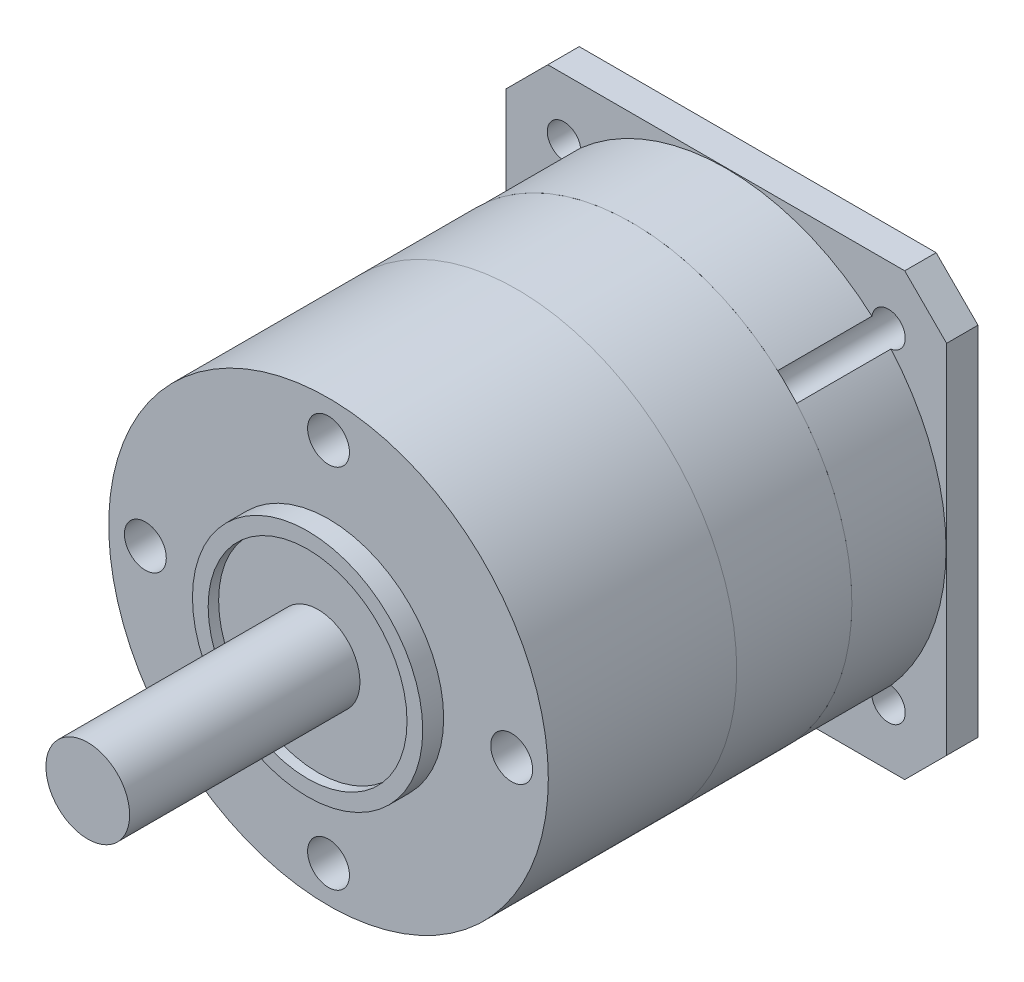
ISO-10303-21;
HEADER;
FILE_DESCRIPTION(('STEP AP214'),'2;1');
FILE_NAME('part.step','',(''),(''),'','','');
FILE_SCHEMA(('AUTOMOTIVE_DESIGN { 1 0 10303 214 1 1 1 1 }'));
ENDSEC;
DATA;
#1=APPLICATION_CONTEXT('core data for automotive mechanical design processes');
#2=APPLICATION_PROTOCOL_DEFINITION('international standard','automotive_design',2000,#1);
#3=PRODUCT_CONTEXT('',#1,'mechanical');
#4=PRODUCT('Part','Part','',(#3));
#5=PRODUCT_RELATED_PRODUCT_CATEGORY('part','',(#4));
#6=PRODUCT_DEFINITION_FORMATION('','',#4);
#7=PRODUCT_DEFINITION_CONTEXT('part definition',#1,'design');
#8=PRODUCT_DEFINITION('design','',#6,#7);
#9=PRODUCT_DEFINITION_SHAPE('','',#8);
#10=(LENGTH_UNIT() NAMED_UNIT(*) SI_UNIT(.MILLI.,.METRE.));
#11=(NAMED_UNIT(*) PLANE_ANGLE_UNIT() SI_UNIT($,.RADIAN.));
#12=(NAMED_UNIT(*) SI_UNIT($,.STERADIAN.) SOLID_ANGLE_UNIT());
#13=UNCERTAINTY_MEASURE_WITH_UNIT(LENGTH_MEASURE(1.E-05),#10,'distance_accuracy_value','');
#14=(GEOMETRIC_REPRESENTATION_CONTEXT(3) GLOBAL_UNCERTAINTY_ASSIGNED_CONTEXT((#13)) GLOBAL_UNIT_ASSIGNED_CONTEXT((#10,
#11,#12)) REPRESENTATION_CONTEXT('',''));
#15=CARTESIAN_POINT('',(0.,0.,0.));
#16=DIRECTION('',(0.,0.,1.));
#17=DIRECTION('',(1.,0.,0.));
#18=AXIS2_PLACEMENT_3D('',#15,#16,#17);
#19=CARTESIAN_POINT('',(0.,0.,64.));
#20=DIRECTION('',(0.,0.,-1.));
#21=DIRECTION('',(-1.,0.,0.));
#22=AXIS2_PLACEMENT_3D('',#19,#20,#21);
#23=CYLINDRICAL_SURFACE('',#22,4.);
#24=CARTESIAN_POINT('',(0.,0.,64.));
#25=DIRECTION('',(0.,0.,1.));
#26=DIRECTION('',(1.,0.,0.));
#27=AXIS2_PLACEMENT_3D('',#24,#25,#26);
#28=CIRCLE('',#27,4.);
#29=CARTESIAN_POINT('',(4.,0.,64.));
#30=VERTEX_POINT('',#29);
#31=EDGE_CURVE('E11',#30,#30,#28,.T.);
#32=ORIENTED_EDGE('',*,*,#31,.F.);
#33=EDGE_LOOP('',(#32));
#34=FACE_BOUND('',#33,.T.);
#35=CARTESIAN_POINT('',(0.,0.,41.));
#36=DIRECTION('',(0.,0.,1.));
#37=DIRECTION('',(1.,0.,0.));
#38=AXIS2_PLACEMENT_3D('',#35,#36,#37);
#39=CIRCLE('',#38,4.);
#40=CARTESIAN_POINT('',(4.,0.,41.));
#41=VERTEX_POINT('',#40);
#42=EDGE_CURVE('E51',#41,#41,#39,.T.);
#43=ORIENTED_EDGE('',*,*,#42,.T.);
#44=EDGE_LOOP('',(#43));
#45=FACE_BOUND('',#44,.T.);
#46=ADVANCED_FACE('F48',(#34,#45),#23,.T.);
#47=CARTESIAN_POINT('',(0.,0.,64.));
#48=DIRECTION('',(0.,0.,1.));
#49=DIRECTION('',(1.,0.,0.));
#50=AXIS2_PLACEMENT_3D('',#47,#48,#49);
#51=PLANE('',#50);
#52=ORIENTED_EDGE('',*,*,#31,.T.);
#53=EDGE_LOOP('',(#52));
#54=FACE_BOUND('',#53,.T.);
#55=ADVANCED_FACE('F63',(#54),#51,.T.);
#56=CARTESIAN_POINT('',(0.,0.,41.));
#57=DIRECTION('',(0.,0.,1.));
#58=DIRECTION('',(1.,0.,0.));
#59=AXIS2_PLACEMENT_3D('',#56,#57,#58);
#60=PLANE('',#59);
#61=ORIENTED_EDGE('',*,*,#42,.F.);
#62=EDGE_LOOP('',(#61));
#63=FACE_BOUND('',#62,.T.);
#64=ADVANCED_FACE('F61',(#63),#60,.F.);
#65=CLOSED_SHELL('',(#46,#55,#64));
#66=MANIFOLD_SOLID_BREP('B2',#65);
#67=CARTESIAN_POINT('',(0.,0.,141.39696961967));
#68=DIRECTION('',(0.,0.,-1.));
#69=DIRECTION('',(-1.,0.,0.));
#70=AXIS2_PLACEMENT_3D('',#67,#68,#69);
#71=CYLINDRICAL_SURFACE('',#70,21.);
#72=CARTESIAN_POINT('',(0.,0.,23.));
#73=DIRECTION('',(0.,0.,1.));
#74=DIRECTION('',(1.,0.,0.));
#75=AXIS2_PLACEMENT_3D('',#72,#73,#74);
#76=CIRCLE('',#75,21.);
#77=CARTESIAN_POINT('',(21.,0.,23.));
#78=VERTEX_POINT('',#77);
#79=EDGE_CURVE('E109',#78,#78,#76,.T.);
#80=ORIENTED_EDGE('',*,*,#79,.T.);
#81=EDGE_LOOP('',(#80));
#82=FACE_BOUND('',#81,.T.);
#83=CARTESIAN_POINT('',(0.,0.,41.));
#84=DIRECTION('',(0.,0.,1.));
#85=DIRECTION('',(1.,0.,0.));
#86=AXIS2_PLACEMENT_3D('',#83,#84,#85);
#87=CIRCLE('',#86,21.);
#88=CARTESIAN_POINT('',(21.,0.,41.));
#89=VERTEX_POINT('',#88);
#90=EDGE_CURVE('E101',#89,#89,#87,.T.);
#91=ORIENTED_EDGE('',*,*,#90,.F.);
#92=EDGE_LOOP('',(#91));
#93=FACE_BOUND('',#92,.T.);
#94=ADVANCED_FACE('F97',(#82,#93),#71,.T.);
#95=CARTESIAN_POINT('',(0.,0.,23.));
#96=DIRECTION('',(0.,0.,1.));
#97=DIRECTION('',(1.,0.,0.));
#98=AXIS2_PLACEMENT_3D('',#95,#96,#97);
#99=PLANE('',#98);
#100=ORIENTED_EDGE('',*,*,#79,.F.);
#101=EDGE_LOOP('',(#100));
#102=FACE_BOUND('',#101,.T.);
#103=ADVANCED_FACE('F164',(#102),#99,.F.);
#104=CARTESIAN_POINT('',(0.,0.,41.));
#105=DIRECTION('',(0.,0.,1.));
#106=DIRECTION('',(1.,0.,0.));
#107=AXIS2_PLACEMENT_3D('',#104,#105,#106);
#108=PLANE('',#107);
#109=CARTESIAN_POINT('',(0.,17.5,41.));
#110=DIRECTION('',(0.,0.,1.));
#111=DIRECTION('',(1.,0.,0.));
#112=AXIS2_PLACEMENT_3D('',#109,#110,#111);
#113=CIRCLE('',#112,2.);
#114=CARTESIAN_POINT('',(2.,17.5,41.));
#115=VERTEX_POINT('',#114);
#116=EDGE_CURVE('E146',#115,#115,#113,.T.);
#117=ORIENTED_EDGE('',*,*,#116,.F.);
#118=EDGE_LOOP('',(#117));
#119=FACE_BOUND('',#118,.T.);
#120=CARTESIAN_POINT('',(17.5000000000005,4.94165217184309E-13,41.));
#121=DIRECTION('',(0.,0.,1.));
#122=DIRECTION('',(1.,0.,0.));
#123=AXIS2_PLACEMENT_3D('',#120,#121,#122);
#124=CIRCLE('',#123,2.);
#125=CARTESIAN_POINT('',(19.5000000000005,4.94165217184309E-13,41.));
#126=VERTEX_POINT('',#125);
#127=EDGE_CURVE('E140',#126,#126,#124,.T.);
#128=ORIENTED_EDGE('',*,*,#127,.F.);
#129=EDGE_LOOP('',(#128));
#130=FACE_BOUND('',#129,.T.);
#131=CARTESIAN_POINT('',(9.88330434368617E-13,-17.5,41.));
#132=DIRECTION('',(0.,0.,1.));
#133=DIRECTION('',(1.,0.,0.));
#134=AXIS2_PLACEMENT_3D('',#131,#132,#133);
#135=CIRCLE('',#134,2.);
#136=CARTESIAN_POINT('',(2.00000000000099,-17.5,41.));
#137=VERTEX_POINT('',#136);
#138=EDGE_CURVE('E134',#137,#137,#135,.T.);
#139=ORIENTED_EDGE('',*,*,#138,.F.);
#140=EDGE_LOOP('',(#139));
#141=FACE_BOUND('',#140,.T.);
#142=CARTESIAN_POINT('',(-17.4999999999995,-4.96308349082816E-13,41.));
#143=DIRECTION('',(0.,0.,1.));
#144=DIRECTION('',(1.,0.,0.));
#145=AXIS2_PLACEMENT_3D('',#142,#143,#144);
#146=CIRCLE('',#145,2.);
#147=CARTESIAN_POINT('',(-15.4999999999995,-4.96308349082816E-13,41.));
#148=VERTEX_POINT('',#147);
#149=EDGE_CURVE('E128',#148,#148,#146,.T.);
#150=ORIENTED_EDGE('',*,*,#149,.F.);
#151=EDGE_LOOP('',(#150));
#152=FACE_BOUND('',#151,.T.);
#153=CARTESIAN_POINT('',(0.,0.,41.));
#154=DIRECTION('',(0.,0.,1.));
#155=DIRECTION('',(1.,0.,0.));
#156=AXIS2_PLACEMENT_3D('',#153,#154,#155);
#157=CIRCLE('',#156,11.);
#158=CARTESIAN_POINT('',(11.,0.,41.));
#159=VERTEX_POINT('',#158);
#160=EDGE_CURVE('E47',#159,#159,#157,.T.);
#161=ORIENTED_EDGE('',*,*,#160,.F.);
#162=EDGE_LOOP('',(#161));
#163=FACE_BOUND('',#162,.T.);
#164=ORIENTED_EDGE('',*,*,#90,.T.);
#165=EDGE_LOOP('',(#164));
#166=FACE_BOUND('',#165,.T.);
#167=ADVANCED_FACE('F99',(#119,#130,#141,#152,#163,#166),#108,.T.);
#168=CARTESIAN_POINT('',(0.,0.,43.));
#169=DIRECTION('',(0.,0.,-1.));
#170=DIRECTION('',(-1.,0.,0.));
#171=AXIS2_PLACEMENT_3D('',#168,#169,#170);
#172=CYLINDRICAL_SURFACE('',#171,11.);
#173=CARTESIAN_POINT('',(0.,0.,43.));
#174=DIRECTION('',(0.,0.,1.));
#175=DIRECTION('',(1.,0.,0.));
#176=AXIS2_PLACEMENT_3D('',#173,#174,#175);
#177=CIRCLE('',#176,11.);
#178=CARTESIAN_POINT('',(11.,0.,43.));
#179=VERTEX_POINT('',#178);
#180=EDGE_CURVE('E111',#179,#179,#177,.T.);
#181=ORIENTED_EDGE('',*,*,#180,.F.);
#182=EDGE_LOOP('',(#181));
#183=FACE_BOUND('',#182,.T.);
#184=ORIENTED_EDGE('',*,*,#160,.T.);
#185=EDGE_LOOP('',(#184));
#186=FACE_BOUND('',#185,.T.);
#187=ADVANCED_FACE('F163',(#183,#186),#172,.T.);
#188=CARTESIAN_POINT('',(0.,0.,43.));
#189=DIRECTION('',(0.,0.,1.));
#190=DIRECTION('',(1.,0.,0.));
#191=AXIS2_PLACEMENT_3D('',#188,#189,#190);
#192=PLANE('',#191);
#193=CARTESIAN_POINT('',(0.,0.,43.));
#194=DIRECTION('',(0.,0.,1.));
#195=DIRECTION('',(1.,0.,0.));
#196=AXIS2_PLACEMENT_3D('',#193,#194,#195);
#197=CIRCLE('',#196,9.5);
#198=CARTESIAN_POINT('',(9.5,0.,43.));
#199=VERTEX_POINT('',#198);
#200=EDGE_CURVE('E121',#199,#199,#197,.T.);
#201=ORIENTED_EDGE('',*,*,#200,.F.);
#202=EDGE_LOOP('',(#201));
#203=FACE_BOUND('',#202,.T.);
#204=ORIENTED_EDGE('',*,*,#180,.T.);
#205=EDGE_LOOP('',(#204));
#206=FACE_BOUND('',#205,.T.);
#207=ADVANCED_FACE('F183',(#203,#206),#192,.T.);
#208=CARTESIAN_POINT('',(0.,0.,42.));
#209=DIRECTION('',(0.,0.,1.));
#210=DIRECTION('',(1.,0.,0.));
#211=AXIS2_PLACEMENT_3D('',#208,#209,#210);
#212=CYLINDRICAL_SURFACE('',#211,9.5);
#213=CARTESIAN_POINT('',(0.,0.,42.));
#214=DIRECTION('',(0.,0.,1.));
#215=DIRECTION('',(1.,0.,0.));
#216=AXIS2_PLACEMENT_3D('',#213,#214,#215);
#217=CIRCLE('',#216,9.5);
#218=CARTESIAN_POINT('',(9.5,0.,42.));
#219=VERTEX_POINT('',#218);
#220=EDGE_CURVE('E117',#219,#219,#217,.T.);
#221=ORIENTED_EDGE('',*,*,#220,.F.);
#222=EDGE_LOOP('',(#221));
#223=FACE_BOUND('',#222,.T.);
#224=ORIENTED_EDGE('',*,*,#200,.T.);
#225=EDGE_LOOP('',(#224));
#226=FACE_BOUND('',#225,.T.);
#227=ADVANCED_FACE('F187',(#223,#226),#212,.F.);
#228=CARTESIAN_POINT('',(0.,0.,42.));
#229=DIRECTION('',(0.,0.,1.));
#230=DIRECTION('',(1.,0.,0.));
#231=AXIS2_PLACEMENT_3D('',#228,#229,#230);
#232=PLANE('',#231);
#233=ORIENTED_EDGE('',*,*,#220,.T.);
#234=EDGE_LOOP('',(#233));
#235=FACE_BOUND('',#234,.T.);
#236=ADVANCED_FACE('F191',(#235),#232,.T.);
#237=CARTESIAN_POINT('',(-17.4999999999995,-4.96308349082816E-13,31.));
#238=DIRECTION('',(0.,0.,1.));
#239=DIRECTION('',(1.,0.,0.));
#240=AXIS2_PLACEMENT_3D('',#237,#238,#239);
#241=CYLINDRICAL_SURFACE('',#240,2.);
#242=CARTESIAN_POINT('',(-17.4999999999995,-4.96308349082816E-13,31.));
#243=DIRECTION('',(0.,0.,1.));
#244=DIRECTION('',(1.,0.,0.));
#245=AXIS2_PLACEMENT_3D('',#242,#243,#244);
#246=CIRCLE('',#245,2.);
#247=CARTESIAN_POINT('',(-15.4999999999995,-4.96308349082816E-13,31.));
#248=VERTEX_POINT('',#247);
#249=EDGE_CURVE('E131',#248,#248,#246,.T.);
#250=ORIENTED_EDGE('',*,*,#249,.F.);
#251=EDGE_LOOP('',(#250));
#252=FACE_BOUND('',#251,.T.);
#253=ORIENTED_EDGE('',*,*,#149,.T.);
#254=EDGE_LOOP('',(#253));
#255=FACE_BOUND('',#254,.T.);
#256=ADVANCED_FACE('F195',(#252,#255),#241,.F.);
#257=CARTESIAN_POINT('',(-17.4999999999995,-4.96308349082816E-13,31.));
#258=DIRECTION('',(0.,0.,1.));
#259=DIRECTION('',(1.,0.,0.));
#260=AXIS2_PLACEMENT_3D('',#257,#258,#259);
#261=PLANE('',#260);
#262=ORIENTED_EDGE('',*,*,#249,.T.);
#263=EDGE_LOOP('',(#262));
#264=FACE_BOUND('',#263,.T.);
#265=ADVANCED_FACE('F198',(#264),#261,.T.);
#266=CARTESIAN_POINT('',(9.88330434368617E-13,-17.5,31.));
#267=DIRECTION('',(0.,0.,1.));
#268=DIRECTION('',(1.,0.,0.));
#269=AXIS2_PLACEMENT_3D('',#266,#267,#268);
#270=CYLINDRICAL_SURFACE('',#269,2.);
#271=CARTESIAN_POINT('',(9.88330434368617E-13,-17.5,31.));
#272=DIRECTION('',(0.,0.,1.));
#273=DIRECTION('',(1.,0.,0.));
#274=AXIS2_PLACEMENT_3D('',#271,#272,#273);
#275=CIRCLE('',#274,2.);
#276=CARTESIAN_POINT('',(2.00000000000099,-17.5,31.));
#277=VERTEX_POINT('',#276);
#278=EDGE_CURVE('E137',#277,#277,#275,.T.);
#279=ORIENTED_EDGE('',*,*,#278,.F.);
#280=EDGE_LOOP('',(#279));
#281=FACE_BOUND('',#280,.T.);
#282=ORIENTED_EDGE('',*,*,#138,.T.);
#283=EDGE_LOOP('',(#282));
#284=FACE_BOUND('',#283,.T.);
#285=ADVANCED_FACE('F202',(#281,#284),#270,.F.);
#286=CARTESIAN_POINT('',(9.88330434368617E-13,-17.5,31.));
#287=DIRECTION('',(0.,0.,1.));
#288=DIRECTION('',(1.,0.,0.));
#289=AXIS2_PLACEMENT_3D('',#286,#287,#288);
#290=PLANE('',#289);
#291=ORIENTED_EDGE('',*,*,#278,.T.);
#292=EDGE_LOOP('',(#291));
#293=FACE_BOUND('',#292,.T.);
#294=ADVANCED_FACE('F206',(#293),#290,.T.);
#295=CARTESIAN_POINT('',(17.5000000000005,4.94165217184309E-13,31.));
#296=DIRECTION('',(0.,0.,1.));
#297=DIRECTION('',(1.,0.,0.));
#298=AXIS2_PLACEMENT_3D('',#295,#296,#297);
#299=CYLINDRICAL_SURFACE('',#298,2.);
#300=CARTESIAN_POINT('',(17.5000000000005,4.94165217184309E-13,31.));
#301=DIRECTION('',(0.,0.,1.));
#302=DIRECTION('',(1.,0.,0.));
#303=AXIS2_PLACEMENT_3D('',#300,#301,#302);
#304=CIRCLE('',#303,2.);
#305=CARTESIAN_POINT('',(19.5000000000005,4.94165217184309E-13,31.));
#306=VERTEX_POINT('',#305);
#307=EDGE_CURVE('E143',#306,#306,#304,.T.);
#308=ORIENTED_EDGE('',*,*,#307,.F.);
#309=EDGE_LOOP('',(#308));
#310=FACE_BOUND('',#309,.T.);
#311=ORIENTED_EDGE('',*,*,#127,.T.);
#312=EDGE_LOOP('',(#311));
#313=FACE_BOUND('',#312,.T.);
#314=ADVANCED_FACE('F210',(#310,#313),#299,.F.);
#315=CARTESIAN_POINT('',(17.5000000000005,4.94165217184309E-13,31.));
#316=DIRECTION('',(0.,0.,1.));
#317=DIRECTION('',(1.,0.,0.));
#318=AXIS2_PLACEMENT_3D('',#315,#316,#317);
#319=PLANE('',#318);
#320=ORIENTED_EDGE('',*,*,#307,.T.);
#321=EDGE_LOOP('',(#320));
#322=FACE_BOUND('',#321,.T.);
#323=ADVANCED_FACE('F157',(#322),#319,.T.);
#324=CARTESIAN_POINT('',(0.,17.5,31.));
#325=DIRECTION('',(0.,0.,1.));
#326=DIRECTION('',(1.,0.,0.));
#327=AXIS2_PLACEMENT_3D('',#324,#325,#326);
#328=CYLINDRICAL_SURFACE('',#327,2.);
#329=CARTESIAN_POINT('',(0.,17.5,31.));
#330=DIRECTION('',(0.,0.,1.));
#331=DIRECTION('',(1.,0.,0.));
#332=AXIS2_PLACEMENT_3D('',#329,#330,#331);
#333=CIRCLE('',#332,2.);
#334=CARTESIAN_POINT('',(2.,17.5,31.));
#335=VERTEX_POINT('',#334);
#336=EDGE_CURVE('E126',#335,#335,#333,.T.);
#337=ORIENTED_EDGE('',*,*,#336,.F.);
#338=EDGE_LOOP('',(#337));
#339=FACE_BOUND('',#338,.T.);
#340=ORIENTED_EDGE('',*,*,#116,.T.);
#341=EDGE_LOOP('',(#340));
#342=FACE_BOUND('',#341,.T.);
#343=ADVANCED_FACE('F154',(#339,#342),#328,.F.);
#344=CARTESIAN_POINT('',(0.,17.5,31.));
#345=DIRECTION('',(0.,0.,1.));
#346=DIRECTION('',(1.,0.,0.));
#347=AXIS2_PLACEMENT_3D('',#344,#345,#346);
#348=PLANE('',#347);
#349=ORIENTED_EDGE('',*,*,#336,.T.);
#350=EDGE_LOOP('',(#349));
#351=FACE_BOUND('',#350,.T.);
#352=ADVANCED_FACE('F152',(#351),#348,.T.);
#353=CLOSED_SHELL('',(#94,#103,#167,#187,#207,#227,#236,#256,#265,#285,#294,#314,#323,#343,#352));
#354=MANIFOLD_SOLID_BREP('B6',#353);
#355=CARTESIAN_POINT('',(0.,0.,105.39696961967));
#356=DIRECTION('',(0.,0.,-1.));
#357=DIRECTION('',(-1.,0.,0.));
#358=AXIS2_PLACEMENT_3D('',#355,#356,#357);
#359=CYLINDRICAL_SURFACE('',#358,21.);
#360=CARTESIAN_POINT('',(0.,0.,12.));
#361=DIRECTION('',(0.,0.,1.));
#362=DIRECTION('',(1.,0.,0.));
#363=AXIS2_PLACEMENT_3D('',#360,#361,#362);
#364=CIRCLE('',#363,21.);
#365=CARTESIAN_POINT('',(21.,0.,12.));
#366=VERTEX_POINT('',#365);
#367=EDGE_CURVE('E335',#366,#366,#364,.T.);
#368=ORIENTED_EDGE('',*,*,#367,.T.);
#369=EDGE_LOOP('',(#368));
#370=FACE_BOUND('',#369,.T.);
#371=CARTESIAN_POINT('',(0.,0.,23.));
#372=DIRECTION('',(0.,0.,1.));
#373=DIRECTION('',(1.,0.,0.));
#374=AXIS2_PLACEMENT_3D('',#371,#372,#373);
#375=CIRCLE('',#374,21.);
#376=CARTESIAN_POINT('',(21.,0.,23.));
#377=VERTEX_POINT('',#376);
#378=EDGE_CURVE('E96',#377,#377,#375,.T.);
#379=ORIENTED_EDGE('',*,*,#378,.F.);
#380=EDGE_LOOP('',(#379));
#381=FACE_BOUND('',#380,.T.);
#382=ADVANCED_FACE('F328',(#370,#381),#359,.T.);
#383=CARTESIAN_POINT('',(0.,0.,12.));
#384=DIRECTION('',(0.,0.,1.));
#385=DIRECTION('',(1.,0.,0.));
#386=AXIS2_PLACEMENT_3D('',#383,#384,#385);
#387=PLANE('',#386);
#388=ORIENTED_EDGE('',*,*,#367,.F.);
#389=EDGE_LOOP('',(#388));
#390=FACE_BOUND('',#389,.T.);
#391=ADVANCED_FACE('F343',(#390),#387,.F.);
#392=CARTESIAN_POINT('',(0.,0.,23.));
#393=DIRECTION('',(0.,0.,1.));
#394=DIRECTION('',(1.,0.,0.));
#395=AXIS2_PLACEMENT_3D('',#392,#393,#394);
#396=PLANE('',#395);
#397=ORIENTED_EDGE('',*,*,#378,.T.);
#398=EDGE_LOOP('',(#397));
#399=FACE_BOUND('',#398,.T.);
#400=ADVANCED_FACE('F330',(#399),#396,.T.);
#401=CLOSED_SHELL('',(#382,#391,#400));
#402=MANIFOLD_SOLID_BREP('B42',#401);
#403=CARTESIAN_POINT('',(0.,0.,83.39696961967));
#404=DIRECTION('',(0.,0.,-1.));
#405=DIRECTION('',(-1.,0.,0.));
#406=AXIS2_PLACEMENT_3D('',#403,#404,#405);
#407=CYLINDRICAL_SURFACE('',#406,21.);
#408=CARTESIAN_POINT('',(0.,0.,3.));
#409=DIRECTION('',(0.,0.,1.));
#410=DIRECTION('',(1.,0.,0.));
#411=AXIS2_PLACEMENT_3D('',#408,#409,#410);
#412=CIRCLE('',#411,21.);
#413=CARTESIAN_POINT('',(-13.9161898270176,-15.727035979434,3.));
#414=VERTEX_POINT('',#413);
#415=CARTESIAN_POINT('',(13.9161898270176,-15.727035979434,3.));
#416=VERTEX_POINT('',#415);
#417=EDGE_CURVE('E534',#414,#416,#412,.T.);
#418=ORIENTED_EDGE('',*,*,#417,.T.);
#419=DIRECTION('',(0.,0.,-1.));
#420=VECTOR('',#419,1.);
#421=CARTESIAN_POINT('',(13.9161898270176,-15.727035979434,7.50000000000001));
#422=LINE('',#421,#420);
#423=CARTESIAN_POINT('',(13.9161898270177,-15.727035979434,12.));
#424=VERTEX_POINT('',#423);
#425=EDGE_CURVE('E573',#424,#416,#422,.T.);
#426=ORIENTED_EDGE('',*,*,#425,.F.);
#427=CARTESIAN_POINT('',(0.,0.,12.));
#428=DIRECTION('',(0.,0.,1.));
#429=DIRECTION('',(1.,0.,0.));
#430=AXIS2_PLACEMENT_3D('',#427,#428,#429);
#431=CIRCLE('',#430,21.);
#432=CARTESIAN_POINT('',(-13.9161898270176,-15.727035979434,12.));
#433=VERTEX_POINT('',#432);
#434=EDGE_CURVE('E518',#433,#424,#431,.T.);
#435=ORIENTED_EDGE('',*,*,#434,.F.);
#436=DIRECTION('',(0.,0.,-1.));
#437=VECTOR('',#436,1.);
#438=CARTESIAN_POINT('',(-13.9161898270176,-15.727035979434,7.50000000000001));
#439=LINE('',#438,#437);
#440=EDGE_CURVE('E560',#414,#433,#439,.F.);
#441=ORIENTED_EDGE('',*,*,#440,.F.);
#442=EDGE_LOOP('',(#418,#426,#435,#441));
#443=FACE_BOUND('',#442,.T.);
#444=ADVANCED_FACE('F370',(#443),#407,.T.);
#445=CARTESIAN_POINT('',(-15.727035979434,13.9161898270176,3.));
#446=VERTEX_POINT('',#445);
#447=CARTESIAN_POINT('',(-15.727035979434,-13.9161898270176,3.));
#448=VERTEX_POINT('',#447);
#449=EDGE_CURVE('E540',#446,#448,#412,.T.);
#450=ORIENTED_EDGE('',*,*,#449,.T.);
#451=DIRECTION('',(0.,0.,-1.));
#452=VECTOR('',#451,1.);
#453=CARTESIAN_POINT('',(-15.727035979434,-13.9161898270176,7.50000000000001));
#454=LINE('',#453,#452);
#455=CARTESIAN_POINT('',(-15.727035979434,-13.9161898270177,12.));
#456=VERTEX_POINT('',#455);
#457=EDGE_CURVE('E551',#456,#448,#454,.T.);
#458=ORIENTED_EDGE('',*,*,#457,.F.);
#459=CARTESIAN_POINT('',(-15.727035979434,13.9161898270176,12.));
#460=VERTEX_POINT('',#459);
#461=EDGE_CURVE('E512',#460,#456,#431,.T.);
#462=ORIENTED_EDGE('',*,*,#461,.F.);
#463=DIRECTION('',(0.,0.,-1.));
#464=VECTOR('',#463,1.);
#465=CARTESIAN_POINT('',(-15.727035979434,13.9161898270176,7.50000000000001));
#466=LINE('',#465,#464);
#467=EDGE_CURVE('E490',#446,#460,#466,.F.);
#468=ORIENTED_EDGE('',*,*,#467,.F.);
#469=EDGE_LOOP('',(#450,#458,#462,#468));
#470=FACE_BOUND('',#469,.T.);
#471=ADVANCED_FACE('F550',(#470),#407,.T.);
#472=CARTESIAN_POINT('',(13.9161898270176,15.727035979434,3.));
#473=VERTEX_POINT('',#472);
#474=CARTESIAN_POINT('',(-13.9161898270176,15.727035979434,3.));
#475=VERTEX_POINT('',#474);
#476=EDGE_CURVE('E504',#473,#475,#412,.T.);
#477=ORIENTED_EDGE('',*,*,#476,.T.);
#478=DIRECTION('',(0.,0.,-1.));
#479=VECTOR('',#478,1.);
#480=CARTESIAN_POINT('',(-13.9161898270176,15.727035979434,7.50000000000001));
#481=LINE('',#480,#479);
#482=CARTESIAN_POINT('',(-13.9161898270177,15.727035979434,12.));
#483=VERTEX_POINT('',#482);
#484=EDGE_CURVE('E487',#483,#475,#481,.T.);
#485=ORIENTED_EDGE('',*,*,#484,.F.);
#486=CARTESIAN_POINT('',(13.9161898270176,15.727035979434,12.));
#487=VERTEX_POINT('',#486);
#488=EDGE_CURVE('E502',#487,#483,#431,.T.);
#489=ORIENTED_EDGE('',*,*,#488,.F.);
#490=DIRECTION('',(0.,0.,-1.));
#491=VECTOR('',#490,1.);
#492=CARTESIAN_POINT('',(13.9161898270176,15.727035979434,7.50000000000001));
#493=LINE('',#492,#491);
#494=EDGE_CURVE('E525',#473,#487,#493,.F.);
#495=ORIENTED_EDGE('',*,*,#494,.F.);
#496=EDGE_LOOP('',(#477,#485,#489,#495));
#497=FACE_BOUND('',#496,.T.);
#498=ADVANCED_FACE('F500',(#497),#407,.T.);
#499=CARTESIAN_POINT('',(-21.05,-21.05,3.));
#500=DIRECTION('',(1.,0.,0.));
#501=DIRECTION('',(0.,0.,-1.));
#502=AXIS2_PLACEMENT_3D('',#499,#500,#501);
#503=PLANE('',#502);
#504=DIRECTION('',(0.,-1.,0.));
#505=VECTOR('',#504,1.);
#506=CARTESIAN_POINT('',(-21.05,-21.05,0.));
#507=LINE('',#506,#505);
#508=CARTESIAN_POINT('',(-21.05,17.05,0.));
#509=VERTEX_POINT('',#508);
#510=CARTESIAN_POINT('',(-21.05,-17.05,0.));
#511=VERTEX_POINT('',#510);
#512=EDGE_CURVE('E511',#509,#511,#507,.T.);
#513=ORIENTED_EDGE('',*,*,#512,.T.);
#514=DIRECTION('',(0.,0.,1.));
#515=VECTOR('',#514,1.);
#516=CARTESIAN_POINT('',(-21.05,-17.05,3.));
#517=LINE('',#516,#515);
#518=CARTESIAN_POINT('',(-21.05,-17.05,3.));
#519=VERTEX_POINT('',#518);
#520=EDGE_CURVE('E666',#511,#519,#517,.T.);
#521=ORIENTED_EDGE('',*,*,#520,.T.);
#522=DIRECTION('',(0.,-1.,0.));
#523=VECTOR('',#522,1.);
#524=CARTESIAN_POINT('',(-21.05,-21.05,3.));
#525=LINE('',#524,#523);
#526=CARTESIAN_POINT('',(-21.05,17.05,3.));
#527=VERTEX_POINT('',#526);
#528=EDGE_CURVE('E640',#527,#519,#525,.T.);
#529=ORIENTED_EDGE('',*,*,#528,.F.);
#530=DIRECTION('',(0.,0.,-1.));
#531=VECTOR('',#530,1.);
#532=CARTESIAN_POINT('',(-21.05,17.05,3.));
#533=LINE('',#532,#531);
#534=EDGE_CURVE('E663',#527,#509,#533,.T.);
#535=ORIENTED_EDGE('',*,*,#534,.T.);
#536=EDGE_LOOP('',(#513,#521,#529,#535));
#537=FACE_BOUND('',#536,.T.);
#538=ADVANCED_FACE('F671',(#537),#503,.F.);
#539=CARTESIAN_POINT('',(21.05,-21.05,3.));
#540=DIRECTION('',(0.,1.,0.));
#541=DIRECTION('',(-1.,0.,0.));
#542=AXIS2_PLACEMENT_3D('',#539,#540,#541);
#543=PLANE('',#542);
#544=DIRECTION('',(1.,0.,0.));
#545=VECTOR('',#544,1.);
#546=CARTESIAN_POINT('',(21.05,-21.05,0.));
#547=LINE('',#546,#545);
#548=CARTESIAN_POINT('',(-17.05,-21.05,0.));
#549=VERTEX_POINT('',#548);
#550=CARTESIAN_POINT('',(17.05,-21.05,0.));
#551=VERTEX_POINT('',#550);
#552=EDGE_CURVE('E516',#549,#551,#547,.T.);
#553=ORIENTED_EDGE('',*,*,#552,.T.);
#554=DIRECTION('',(0.,0.,1.));
#555=VECTOR('',#554,1.);
#556=CARTESIAN_POINT('',(17.05,-21.05,3.));
#557=LINE('',#556,#555);
#558=CARTESIAN_POINT('',(17.05,-21.05,3.));
#559=VERTEX_POINT('',#558);
#560=EDGE_CURVE('E654',#551,#559,#557,.T.);
#561=ORIENTED_EDGE('',*,*,#560,.T.);
#562=DIRECTION('',(1.,0.,0.));
#563=VECTOR('',#562,1.);
#564=CARTESIAN_POINT('',(21.05,-21.05,3.));
#565=LINE('',#564,#563);
#566=CARTESIAN_POINT('',(-17.05,-21.05,3.));
#567=VERTEX_POINT('',#566);
#568=EDGE_CURVE('E679',#567,#559,#565,.T.);
#569=ORIENTED_EDGE('',*,*,#568,.F.);
#570=DIRECTION('',(0.,0.,-1.));
#571=VECTOR('',#570,1.);
#572=CARTESIAN_POINT('',(-17.05,-21.05,3.));
#573=LINE('',#572,#571);
#574=EDGE_CURVE('E651',#567,#549,#573,.T.);
#575=ORIENTED_EDGE('',*,*,#574,.T.);
#576=EDGE_LOOP('',(#553,#561,#569,#575));
#577=FACE_BOUND('',#576,.T.);
#578=ADVANCED_FACE('F683',(#577),#543,.F.);
#579=CARTESIAN_POINT('',(21.05,-21.05,3.));
#580=DIRECTION('',(-1.,0.,0.));
#581=DIRECTION('',(0.,0.,1.));
#582=AXIS2_PLACEMENT_3D('',#579,#580,#581);
#583=PLANE('',#582);
#584=DIRECTION('',(0.,1.,0.));
#585=VECTOR('',#584,1.);
#586=CARTESIAN_POINT('',(21.05,-21.05,3.));
#587=LINE('',#586,#585);
#588=CARTESIAN_POINT('',(21.05,-17.05,3.));
#589=VERTEX_POINT('',#588);
#590=CARTESIAN_POINT('',(21.05,17.05,3.));
#591=VERTEX_POINT('',#590);
#592=EDGE_CURVE('E541',#589,#591,#587,.T.);
#593=ORIENTED_EDGE('',*,*,#592,.F.);
#594=DIRECTION('',(0.,0.,-1.));
#595=VECTOR('',#594,1.);
#596=CARTESIAN_POINT('',(21.05,-17.05,3.));
#597=LINE('',#596,#595);
#598=CARTESIAN_POINT('',(21.05,-17.05,0.));
#599=VERTEX_POINT('',#598);
#600=EDGE_CURVE('E544',#589,#599,#597,.T.);
#601=ORIENTED_EDGE('',*,*,#600,.T.);
#602=DIRECTION('',(0.,1.,0.));
#603=VECTOR('',#602,1.);
#604=CARTESIAN_POINT('',(21.05,-21.05,0.));
#605=LINE('',#604,#603);
#606=CARTESIAN_POINT('',(21.05,17.05,0.));
#607=VERTEX_POINT('',#606);
#608=EDGE_CURVE('E629',#599,#607,#605,.T.);
#609=ORIENTED_EDGE('',*,*,#608,.T.);
#610=DIRECTION('',(0.,0.,1.));
#611=VECTOR('',#610,1.);
#612=CARTESIAN_POINT('',(21.05,17.05,3.));
#613=LINE('',#612,#611);
#614=EDGE_CURVE('E543',#607,#591,#613,.T.);
#615=ORIENTED_EDGE('',*,*,#614,.T.);
#616=EDGE_LOOP('',(#593,#601,#609,#615));
#617=FACE_BOUND('',#616,.T.);
#618=ADVANCED_FACE('F713',(#617),#583,.F.);
#619=CARTESIAN_POINT('',(21.05,21.05,3.));
#620=DIRECTION('',(0.,-1.,0.));
#621=DIRECTION('',(1.,0.,0.));
#622=AXIS2_PLACEMENT_3D('',#619,#620,#621);
#623=PLANE('',#622);
#624=DIRECTION('',(-1.,0.,0.));
#625=VECTOR('',#624,1.);
#626=CARTESIAN_POINT('',(21.05,21.05,3.));
#627=LINE('',#626,#625);
#628=CARTESIAN_POINT('',(17.05,21.05,3.));
#629=VERTEX_POINT('',#628);
#630=CARTESIAN_POINT('',(-17.05,21.05,3.));
#631=VERTEX_POINT('',#630);
#632=EDGE_CURVE('E535',#629,#631,#627,.T.);
#633=ORIENTED_EDGE('',*,*,#632,.F.);
#634=DIRECTION('',(0.,0.,-1.));
#635=VECTOR('',#634,1.);
#636=CARTESIAN_POINT('',(17.05,21.05,3.));
#637=LINE('',#636,#635);
#638=CARTESIAN_POINT('',(17.05,21.05,0.));
#639=VERTEX_POINT('',#638);
#640=EDGE_CURVE('E326',#629,#639,#637,.T.);
#641=ORIENTED_EDGE('',*,*,#640,.T.);
#642=DIRECTION('',(-1.,0.,0.));
#643=VECTOR('',#642,1.);
#644=CARTESIAN_POINT('',(21.05,21.05,0.));
#645=LINE('',#644,#643);
#646=CARTESIAN_POINT('',(-17.05,21.05,0.));
#647=VERTEX_POINT('',#646);
#648=EDGE_CURVE('E638',#639,#647,#645,.T.);
#649=ORIENTED_EDGE('',*,*,#648,.T.);
#650=DIRECTION('',(0.,0.,1.));
#651=VECTOR('',#650,1.);
#652=CARTESIAN_POINT('',(-17.05,21.05,3.));
#653=LINE('',#652,#651);
#654=EDGE_CURVE('E378',#647,#631,#653,.T.);
#655=ORIENTED_EDGE('',*,*,#654,.T.);
#656=EDGE_LOOP('',(#633,#641,#649,#655));
#657=FACE_BOUND('',#656,.T.);
#658=ADVANCED_FACE('F686',(#657),#623,.F.);
#659=CARTESIAN_POINT('',(0.,0.,3.));
#660=DIRECTION('',(0.,0.,1.));
#661=DIRECTION('',(1.,0.,0.));
#662=AXIS2_PLACEMENT_3D('',#659,#660,#661);
#663=PLANE('',#662);
#664=CARTESIAN_POINT('',(15.5,-15.5,3.));
#665=DIRECTION('',(0.,0.,1.));
#666=DIRECTION('',(1.,0.,0.));
#667=AXIS2_PLACEMENT_3D('',#664,#665,#666);
#668=CIRCLE('',#667,1.6);
#669=CARTESIAN_POINT('',(15.727035979434,-13.9161898270176,3.));
#670=VERTEX_POINT('',#669);
#671=EDGE_CURVE('E577',#670,#416,#668,.F.);
#672=ORIENTED_EDGE('',*,*,#671,.T.);
#673=ORIENTED_EDGE('',*,*,#417,.F.);
#674=CARTESIAN_POINT('',(-15.5,-15.5,3.));
#675=DIRECTION('',(0.,0.,1.));
#676=DIRECTION('',(1.,0.,0.));
#677=AXIS2_PLACEMENT_3D('',#674,#675,#676);
#678=CIRCLE('',#677,1.6);
#679=EDGE_CURVE('E557',#414,#448,#678,.F.);
#680=ORIENTED_EDGE('',*,*,#679,.T.);
#681=ORIENTED_EDGE('',*,*,#449,.F.);
#682=CARTESIAN_POINT('',(-15.5,15.5,3.));
#683=DIRECTION('',(0.,0.,1.));
#684=DIRECTION('',(1.,0.,0.));
#685=AXIS2_PLACEMENT_3D('',#682,#683,#684);
#686=CIRCLE('',#685,1.6);
#687=EDGE_CURVE('E555',#446,#475,#686,.F.);
#688=ORIENTED_EDGE('',*,*,#687,.T.);
#689=ORIENTED_EDGE('',*,*,#476,.F.);
#690=CARTESIAN_POINT('',(15.5,15.5,3.));
#691=DIRECTION('',(0.,0.,1.));
#692=DIRECTION('',(1.,0.,0.));
#693=AXIS2_PLACEMENT_3D('',#690,#691,#692);
#694=CIRCLE('',#693,1.6);
#695=CARTESIAN_POINT('',(15.727035979434,13.9161898270176,3.));
#696=VERTEX_POINT('',#695);
#697=EDGE_CURVE('E521',#473,#696,#694,.F.);
#698=ORIENTED_EDGE('',*,*,#697,.T.);
#699=EDGE_CURVE('E533',#670,#696,#412,.T.);
#700=ORIENTED_EDGE('',*,*,#699,.F.);
#701=EDGE_LOOP('',(#672,#673,#680,#681,#688,#689,#698,#700));
#702=FACE_BOUND('',#701,.T.);
#703=ORIENTED_EDGE('',*,*,#568,.T.);
#704=DIRECTION('',(-0.707106781186549,-0.707106781186546,0.));
#705=VECTOR('',#704,1.);
#706=CARTESIAN_POINT('',(19.05,-19.05,3.));
#707=LINE('',#706,#705);
#708=EDGE_CURVE('E661',#559,#589,#707,.F.);
#709=ORIENTED_EDGE('',*,*,#708,.T.);
#710=ORIENTED_EDGE('',*,*,#592,.T.);
#711=DIRECTION('',(0.707106781186546,-0.707106781186549,0.));
#712=VECTOR('',#711,1.);
#713=CARTESIAN_POINT('',(19.05,19.05,3.));
#714=LINE('',#713,#712);
#715=EDGE_CURVE('E391',#591,#629,#714,.F.);
#716=ORIENTED_EDGE('',*,*,#715,.T.);
#717=ORIENTED_EDGE('',*,*,#632,.T.);
#718=DIRECTION('',(0.707106781186549,0.707106781186546,0.));
#719=VECTOR('',#718,1.);
#720=CARTESIAN_POINT('',(-19.05,19.05,3.));
#721=LINE('',#720,#719);
#722=EDGE_CURVE('E656',#631,#527,#721,.F.);
#723=ORIENTED_EDGE('',*,*,#722,.T.);
#724=ORIENTED_EDGE('',*,*,#528,.T.);
#725=DIRECTION('',(-0.707106781186546,0.707106781186549,0.));
#726=VECTOR('',#725,1.);
#727=CARTESIAN_POINT('',(-19.05,-19.05,3.));
#728=LINE('',#727,#726);
#729=EDGE_CURVE('E659',#519,#567,#728,.F.);
#730=ORIENTED_EDGE('',*,*,#729,.T.);
#731=EDGE_LOOP('',(#703,#709,#710,#716,#717,#723,#724,#730));
#732=FACE_BOUND('',#731,.T.);
#733=ADVANCED_FACE('F554',(#702,#732),#663,.T.);
#734=CARTESIAN_POINT('',(0.,0.,0.));
#735=DIRECTION('',(0.,0.,1.));
#736=DIRECTION('',(1.,0.,0.));
#737=AXIS2_PLACEMENT_3D('',#734,#735,#736);
#738=PLANE('',#737);
#739=CARTESIAN_POINT('',(0.,0.,0.));
#740=DIRECTION('',(0.,0.,-1.));
#741=DIRECTION('',(-1.,0.,0.));
#742=AXIS2_PLACEMENT_3D('',#739,#740,#741);
#743=CIRCLE('',#742,11.);
#744=CARTESIAN_POINT('',(-11.,0.,0.));
#745=VERTEX_POINT('',#744);
#746=EDGE_CURVE('E601',#745,#745,#743,.T.);
#747=ORIENTED_EDGE('',*,*,#746,.F.);
#748=EDGE_LOOP('',(#747));
#749=FACE_BOUND('',#748,.T.);
#750=CARTESIAN_POINT('',(15.5,-15.5,0.));
#751=DIRECTION('',(0.,0.,-1.));
#752=DIRECTION('',(-1.,0.,0.));
#753=AXIS2_PLACEMENT_3D('',#750,#751,#752);
#754=CIRCLE('',#753,1.6);
#755=CARTESIAN_POINT('',(13.9,-15.5,0.));
#756=VERTEX_POINT('',#755);
#757=EDGE_CURVE('E567',#756,#756,#754,.T.);
#758=ORIENTED_EDGE('',*,*,#757,.F.);
#759=EDGE_LOOP('',(#758));
#760=FACE_BOUND('',#759,.T.);
#761=CARTESIAN_POINT('',(-15.5,-15.5,0.));
#762=DIRECTION('',(0.,0.,-1.));
#763=DIRECTION('',(-1.,0.,0.));
#764=AXIS2_PLACEMENT_3D('',#761,#762,#763);
#765=CIRCLE('',#764,1.6);
#766=CARTESIAN_POINT('',(-17.1,-15.5,0.));
#767=VERTEX_POINT('',#766);
#768=EDGE_CURVE('E579',#767,#767,#765,.T.);
#769=ORIENTED_EDGE('',*,*,#768,.F.);
#770=EDGE_LOOP('',(#769));
#771=FACE_BOUND('',#770,.T.);
#772=CARTESIAN_POINT('',(-15.5,15.5,0.));
#773=DIRECTION('',(0.,0.,-1.));
#774=DIRECTION('',(-1.,0.,0.));
#775=AXIS2_PLACEMENT_3D('',#772,#773,#774);
#776=CIRCLE('',#775,1.6);
#777=CARTESIAN_POINT('',(-17.1,15.5,0.));
#778=VERTEX_POINT('',#777);
#779=EDGE_CURVE('E495',#778,#778,#776,.T.);
#780=ORIENTED_EDGE('',*,*,#779,.F.);
#781=EDGE_LOOP('',(#780));
#782=FACE_BOUND('',#781,.T.);
#783=CARTESIAN_POINT('',(15.5,15.5,0.));
#784=DIRECTION('',(0.,0.,-1.));
#785=DIRECTION('',(-1.,0.,0.));
#786=AXIS2_PLACEMENT_3D('',#783,#784,#785);
#787=CIRCLE('',#786,1.6);
#788=CARTESIAN_POINT('',(13.9,15.5,0.));
#789=VERTEX_POINT('',#788);
#790=EDGE_CURVE('E580',#789,#789,#787,.T.);
#791=ORIENTED_EDGE('',*,*,#790,.F.);
#792=EDGE_LOOP('',(#791));
#793=FACE_BOUND('',#792,.T.);
#794=ORIENTED_EDGE('',*,*,#608,.F.);
#795=DIRECTION('',(0.707106781186549,0.707106781186546,0.));
#796=VECTOR('',#795,1.);
#797=CARTESIAN_POINT('',(21.05,-17.05,0.));
#798=LINE('',#797,#796);
#799=EDGE_CURVE('E631',#599,#551,#798,.F.);
#800=ORIENTED_EDGE('',*,*,#799,.T.);
#801=ORIENTED_EDGE('',*,*,#552,.F.);
#802=DIRECTION('',(0.707106781186546,-0.707106781186549,0.));
#803=VECTOR('',#802,1.);
#804=CARTESIAN_POINT('',(-17.05,-21.05,0.));
#805=LINE('',#804,#803);
#806=EDGE_CURVE('E648',#549,#511,#805,.F.);
#807=ORIENTED_EDGE('',*,*,#806,.T.);
#808=ORIENTED_EDGE('',*,*,#512,.F.);
#809=DIRECTION('',(-0.707106781186549,-0.707106781186546,0.));
#810=VECTOR('',#809,1.);
#811=CARTESIAN_POINT('',(-21.05,17.05,0.));
#812=LINE('',#811,#810);
#813=EDGE_CURVE('E645',#509,#647,#812,.F.);
#814=ORIENTED_EDGE('',*,*,#813,.T.);
#815=ORIENTED_EDGE('',*,*,#648,.F.);
#816=DIRECTION('',(-0.707106781186546,0.707106781186549,0.));
#817=VECTOR('',#816,1.);
#818=CARTESIAN_POINT('',(17.05,21.05,0.));
#819=LINE('',#818,#817);
#820=EDGE_CURVE('E634',#639,#607,#819,.F.);
#821=ORIENTED_EDGE('',*,*,#820,.T.);
#822=EDGE_LOOP('',(#794,#800,#801,#807,#808,#814,#815,#821));
#823=FACE_BOUND('',#822,.T.);
#824=ADVANCED_FACE('F615',(#749,#760,#771,#782,#793,#823),#738,.F.);
#825=CARTESIAN_POINT('',(15.727035979434,-13.9161898270176,12.));
#826=VERTEX_POINT('',#825);
#827=CARTESIAN_POINT('',(15.727035979434,13.9161898270177,12.));
#828=VERTEX_POINT('',#827);
#829=EDGE_CURVE('E514',#826,#828,#431,.T.);
#830=ORIENTED_EDGE('',*,*,#829,.F.);
#831=DIRECTION('',(0.,0.,-1.));
#832=VECTOR('',#831,1.);
#833=CARTESIAN_POINT('',(15.727035979434,-13.9161898270176,7.50000000000001));
#834=LINE('',#833,#832);
#835=EDGE_CURVE('E575',#670,#826,#834,.F.);
#836=ORIENTED_EDGE('',*,*,#835,.F.);
#837=ORIENTED_EDGE('',*,*,#699,.T.);
#838=DIRECTION('',(0.,0.,-1.));
#839=VECTOR('',#838,1.);
#840=CARTESIAN_POINT('',(15.727035979434,13.9161898270176,7.50000000000001));
#841=LINE('',#840,#839);
#842=EDGE_CURVE('E530',#828,#696,#841,.T.);
#843=ORIENTED_EDGE('',*,*,#842,.F.);
#844=EDGE_LOOP('',(#830,#836,#837,#843));
#845=FACE_BOUND('',#844,.T.);
#846=ADVANCED_FACE('F586',(#845),#407,.T.);
#847=CARTESIAN_POINT('',(0.,0.,12.));
#848=DIRECTION('',(0.,0.,1.));
#849=DIRECTION('',(1.,0.,0.));
#850=AXIS2_PLACEMENT_3D('',#847,#848,#849);
#851=PLANE('',#850);
#852=CARTESIAN_POINT('',(15.5,-15.5,12.));
#853=DIRECTION('',(0.,0.,1.));
#854=DIRECTION('',(1.,0.,0.));
#855=AXIS2_PLACEMENT_3D('',#852,#853,#854);
#856=CIRCLE('',#855,1.6);
#857=EDGE_CURVE('E570',#424,#826,#856,.F.);
#858=ORIENTED_EDGE('',*,*,#857,.T.);
#859=ORIENTED_EDGE('',*,*,#829,.T.);
#860=CARTESIAN_POINT('',(15.5,15.5,12.));
#861=DIRECTION('',(0.,0.,1.));
#862=DIRECTION('',(1.,0.,0.));
#863=AXIS2_PLACEMENT_3D('',#860,#861,#862);
#864=CIRCLE('',#863,1.6);
#865=EDGE_CURVE('E510',#828,#487,#864,.F.);
#866=ORIENTED_EDGE('',*,*,#865,.T.);
#867=ORIENTED_EDGE('',*,*,#488,.T.);
#868=CARTESIAN_POINT('',(-15.5,15.5,12.));
#869=DIRECTION('',(0.,0.,1.));
#870=DIRECTION('',(1.,0.,0.));
#871=AXIS2_PLACEMENT_3D('',#868,#869,#870);
#872=CIRCLE('',#871,1.6);
#873=EDGE_CURVE('E483',#483,#460,#872,.F.);
#874=ORIENTED_EDGE('',*,*,#873,.T.);
#875=ORIENTED_EDGE('',*,*,#461,.T.);
#876=CARTESIAN_POINT('',(-15.5,-15.5,12.));
#877=DIRECTION('',(0.,0.,1.));
#878=DIRECTION('',(1.,0.,0.));
#879=AXIS2_PLACEMENT_3D('',#876,#877,#878);
#880=CIRCLE('',#879,1.6);
#881=EDGE_CURVE('E594',#456,#433,#880,.F.);
#882=ORIENTED_EDGE('',*,*,#881,.T.);
#883=ORIENTED_EDGE('',*,*,#434,.T.);
#884=EDGE_LOOP('',(#858,#859,#866,#867,#874,#875,#882,#883));
#885=FACE_BOUND('',#884,.T.);
#886=ADVANCED_FACE('F508',(#885),#851,.T.);
#887=CARTESIAN_POINT('',(15.5,15.5,64.001));
#888=DIRECTION('',(0.,0.,-1.));
#889=DIRECTION('',(-1.,0.,0.));
#890=AXIS2_PLACEMENT_3D('',#887,#888,#889);
#891=CYLINDRICAL_SURFACE('',#890,1.6);
#892=ORIENTED_EDGE('',*,*,#494,.T.);
#893=ORIENTED_EDGE('',*,*,#865,.F.);
#894=ORIENTED_EDGE('',*,*,#842,.T.);
#895=ORIENTED_EDGE('',*,*,#697,.F.);
#896=EDGE_LOOP('',(#892,#893,#894,#895));
#897=FACE_BOUND('',#896,.T.);
#898=ORIENTED_EDGE('',*,*,#790,.T.);
#899=EDGE_LOOP('',(#898));
#900=FACE_BOUND('',#899,.T.);
#901=ADVANCED_FACE('F584',(#897,#900),#891,.F.);
#902=CARTESIAN_POINT('',(-15.5,15.5,64.001));
#903=DIRECTION('',(0.,0.,-1.));
#904=DIRECTION('',(-1.,0.,0.));
#905=AXIS2_PLACEMENT_3D('',#902,#903,#904);
#906=CYLINDRICAL_SURFACE('',#905,1.6);
#907=ORIENTED_EDGE('',*,*,#467,.T.);
#908=ORIENTED_EDGE('',*,*,#873,.F.);
#909=ORIENTED_EDGE('',*,*,#484,.T.);
#910=ORIENTED_EDGE('',*,*,#687,.F.);
#911=EDGE_LOOP('',(#907,#908,#909,#910));
#912=FACE_BOUND('',#911,.T.);
#913=ORIENTED_EDGE('',*,*,#779,.T.);
#914=EDGE_LOOP('',(#913));
#915=FACE_BOUND('',#914,.T.);
#916=ADVANCED_FACE('F485',(#912,#915),#906,.F.);
#917=CARTESIAN_POINT('',(-15.5,-15.5,64.001));
#918=DIRECTION('',(0.,0.,-1.));
#919=DIRECTION('',(-1.,0.,0.));
#920=AXIS2_PLACEMENT_3D('',#917,#918,#919);
#921=CYLINDRICAL_SURFACE('',#920,1.6);
#922=ORIENTED_EDGE('',*,*,#440,.T.);
#923=ORIENTED_EDGE('',*,*,#881,.F.);
#924=ORIENTED_EDGE('',*,*,#457,.T.);
#925=ORIENTED_EDGE('',*,*,#679,.F.);
#926=EDGE_LOOP('',(#922,#923,#924,#925));
#927=FACE_BOUND('',#926,.T.);
#928=ORIENTED_EDGE('',*,*,#768,.T.);
#929=EDGE_LOOP('',(#928));
#930=FACE_BOUND('',#929,.T.);
#931=ADVANCED_FACE('F592',(#927,#930),#921,.F.);
#932=CARTESIAN_POINT('',(15.5,-15.5,64.001));
#933=DIRECTION('',(0.,0.,-1.));
#934=DIRECTION('',(-1.,0.,0.));
#935=AXIS2_PLACEMENT_3D('',#932,#933,#934);
#936=CYLINDRICAL_SURFACE('',#935,1.6);
#937=ORIENTED_EDGE('',*,*,#835,.T.);
#938=ORIENTED_EDGE('',*,*,#857,.F.);
#939=ORIENTED_EDGE('',*,*,#425,.T.);
#940=ORIENTED_EDGE('',*,*,#671,.F.);
#941=EDGE_LOOP('',(#937,#938,#939,#940));
#942=FACE_BOUND('',#941,.T.);
#943=ORIENTED_EDGE('',*,*,#757,.T.);
#944=EDGE_LOOP('',(#943));
#945=FACE_BOUND('',#944,.T.);
#946=ADVANCED_FACE('F720',(#942,#945),#936,.F.);
#947=CARTESIAN_POINT('',(21.05,-17.05,3.));
#948=DIRECTION('',(-0.707106781186546,0.707106781186549,0.));
#949=DIRECTION('',(0.,0.,-1.));
#950=AXIS2_PLACEMENT_3D('',#947,#948,#949);
#951=PLANE('',#950);
#952=ORIENTED_EDGE('',*,*,#708,.F.);
#953=ORIENTED_EDGE('',*,*,#560,.F.);
#954=ORIENTED_EDGE('',*,*,#799,.F.);
#955=ORIENTED_EDGE('',*,*,#600,.F.);
#956=EDGE_LOOP('',(#952,#953,#954,#955));
#957=FACE_BOUND('',#956,.T.);
#958=ADVANCED_FACE('F717',(#957),#951,.F.);
#959=CARTESIAN_POINT('',(-17.05,-21.05,3.));
#960=DIRECTION('',(0.707106781186549,0.707106781186546,0.));
#961=DIRECTION('',(0.,0.,-1.));
#962=AXIS2_PLACEMENT_3D('',#959,#960,#961);
#963=PLANE('',#962);
#964=ORIENTED_EDGE('',*,*,#729,.F.);
#965=ORIENTED_EDGE('',*,*,#520,.F.);
#966=ORIENTED_EDGE('',*,*,#806,.F.);
#967=ORIENTED_EDGE('',*,*,#574,.F.);
#968=EDGE_LOOP('',(#964,#965,#966,#967));
#969=FACE_BOUND('',#968,.T.);
#970=ADVANCED_FACE('F681',(#969),#963,.F.);
#971=CARTESIAN_POINT('',(17.05,21.05,3.));
#972=DIRECTION('',(-0.707106781186549,-0.707106781186546,0.));
#973=DIRECTION('',(0.,0.,-1.));
#974=AXIS2_PLACEMENT_3D('',#971,#972,#973);
#975=PLANE('',#974);
#976=ORIENTED_EDGE('',*,*,#715,.F.);
#977=ORIENTED_EDGE('',*,*,#614,.F.);
#978=ORIENTED_EDGE('',*,*,#820,.F.);
#979=ORIENTED_EDGE('',*,*,#640,.F.);
#980=EDGE_LOOP('',(#976,#977,#978,#979));
#981=FACE_BOUND('',#980,.T.);
#982=ADVANCED_FACE('F689',(#981),#975,.F.);
#983=CARTESIAN_POINT('',(-21.05,17.05,3.));
#984=DIRECTION('',(0.707106781186546,-0.707106781186549,0.));
#985=DIRECTION('',(0.,0.,-1.));
#986=AXIS2_PLACEMENT_3D('',#983,#984,#985);
#987=PLANE('',#986);
#988=ORIENTED_EDGE('',*,*,#722,.F.);
#989=ORIENTED_EDGE('',*,*,#654,.F.);
#990=ORIENTED_EDGE('',*,*,#813,.F.);
#991=ORIENTED_EDGE('',*,*,#534,.F.);
#992=EDGE_LOOP('',(#988,#989,#990,#991));
#993=FACE_BOUND('',#992,.T.);
#994=ADVANCED_FACE('F372',(#993),#987,.F.);
#995=CARTESIAN_POINT('',(0.,0.,1.5));
#996=DIRECTION('',(0.,0.,-1.));
#997=DIRECTION('',(-1.,0.,0.));
#998=AXIS2_PLACEMENT_3D('',#995,#996,#997);
#999=CYLINDRICAL_SURFACE('',#998,11.);
#1000=CARTESIAN_POINT('',(0.,0.,1.5));
#1001=DIRECTION('',(0.,0.,-1.));
#1002=DIRECTION('',(-1.,0.,0.));
#1003=AXIS2_PLACEMENT_3D('',#1000,#1001,#1002);
#1004=CIRCLE('',#1003,11.);
#1005=CARTESIAN_POINT('',(-11.,0.,1.5));
#1006=VERTEX_POINT('',#1005);
#1007=EDGE_CURVE('E571',#1006,#1006,#1004,.T.);
#1008=ORIENTED_EDGE('',*,*,#1007,.F.);
#1009=EDGE_LOOP('',(#1008));
#1010=FACE_BOUND('',#1009,.T.);
#1011=ORIENTED_EDGE('',*,*,#746,.T.);
#1012=EDGE_LOOP('',(#1011));
#1013=FACE_BOUND('',#1012,.T.);
#1014=ADVANCED_FACE('F609',(#1010,#1013),#999,.F.);
#1015=CARTESIAN_POINT('',(0.,0.,1.5));
#1016=DIRECTION('',(0.,0.,-1.));
#1017=DIRECTION('',(-1.,0.,0.));
#1018=AXIS2_PLACEMENT_3D('',#1015,#1016,#1017);
#1019=PLANE('',#1018);
#1020=ORIENTED_EDGE('',*,*,#1007,.T.);
#1021=EDGE_LOOP('',(#1020));
#1022=FACE_BOUND('',#1021,.T.);
#1023=ADVANCED_FACE('F607',(#1022),#1019,.T.);
#1024=CLOSED_SHELL('',(#444,#471,#498,#538,#578,#618,#658,#733,#824,#846,#886,#901,#916,#931,
#946,#958,#970,#982,#994,#1014,#1023));
#1025=MANIFOLD_SOLID_BREP('B91',#1024);
#1026=ADVANCED_BREP_SHAPE_REPRESENTATION('',(#18,#66,#354,#402,#1025),#14);
#1027=SHAPE_DEFINITION_REPRESENTATION(#9,#1026);
ENDSEC;
END-ISO-10303-21;
